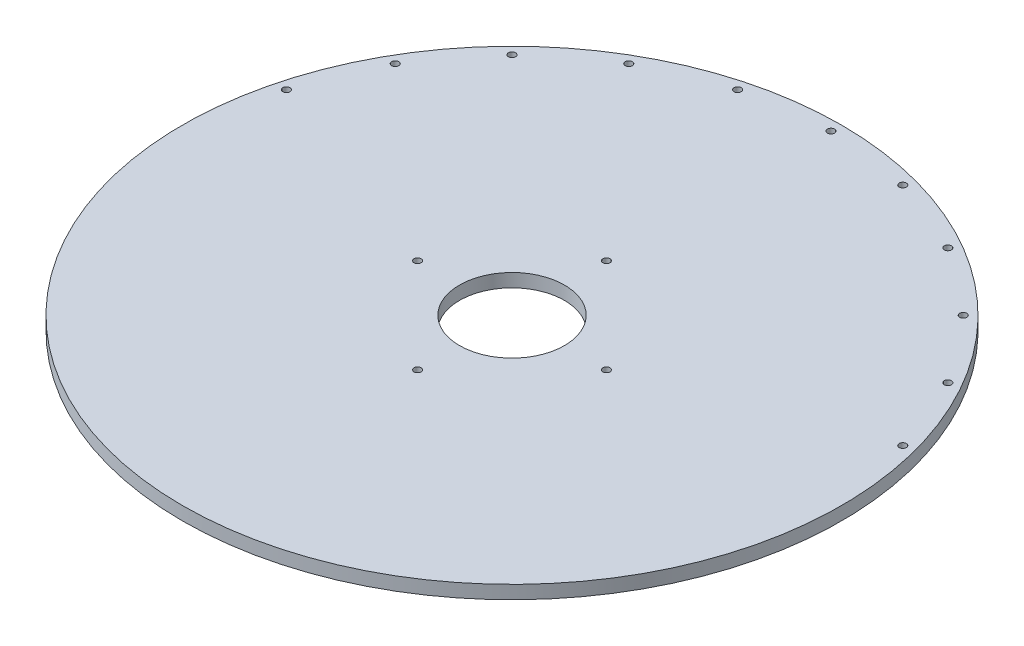
ISO-10303-21;
HEADER;
FILE_DESCRIPTION(('STEP AP214'),'2;1');
FILE_NAME('part.step','',(''),(''),'','','');
FILE_SCHEMA(('AUTOMOTIVE_DESIGN { 1 0 10303 214 1 1 1 1 }'));
ENDSEC;
DATA;
#1=APPLICATION_CONTEXT('core data for automotive mechanical design processes');
#2=APPLICATION_PROTOCOL_DEFINITION('international standard','automotive_design',2000,#1);
#3=PRODUCT_CONTEXT('',#1,'mechanical');
#4=PRODUCT('Part','Part','',(#3));
#5=PRODUCT_RELATED_PRODUCT_CATEGORY('part','',(#4));
#6=PRODUCT_DEFINITION_FORMATION('','',#4);
#7=PRODUCT_DEFINITION_CONTEXT('part definition',#1,'design');
#8=PRODUCT_DEFINITION('design','',#6,#7);
#9=PRODUCT_DEFINITION_SHAPE('','',#8);
#10=(LENGTH_UNIT() NAMED_UNIT(*) SI_UNIT(.MILLI.,.METRE.));
#11=(NAMED_UNIT(*) PLANE_ANGLE_UNIT() SI_UNIT($,.RADIAN.));
#12=(NAMED_UNIT(*) SI_UNIT($,.STERADIAN.) SOLID_ANGLE_UNIT());
#13=UNCERTAINTY_MEASURE_WITH_UNIT(LENGTH_MEASURE(1.E-05),#10,'distance_accuracy_value','');
#14=(GEOMETRIC_REPRESENTATION_CONTEXT(3) GLOBAL_UNCERTAINTY_ASSIGNED_CONTEXT((#13)) GLOBAL_UNIT_ASSIGNED_CONTEXT((#10,
#11,#12)) REPRESENTATION_CONTEXT('',''));
#15=CARTESIAN_POINT('',(0.,0.,0.));
#16=DIRECTION('',(0.,0.,1.));
#17=DIRECTION('',(1.,0.,0.));
#18=AXIS2_PLACEMENT_3D('',#15,#16,#17);
#19=CARTESIAN_POINT('',(0.,-6.35,0.));
#20=DIRECTION('',(0.,1.,0.));
#21=DIRECTION('',(0.,0.,1.));
#22=AXIS2_PLACEMENT_3D('',#19,#20,#21);
#23=CYLINDRICAL_SURFACE('',#22,157.);
#24=CARTESIAN_POINT('',(0.,-6.35,0.));
#25=DIRECTION('',(0.,1.,0.));
#26=DIRECTION('',(0.,0.,1.));
#27=AXIS2_PLACEMENT_3D('',#24,#25,#26);
#28=CIRCLE('',#27,157.);
#29=CARTESIAN_POINT('',(0.,-6.35,157.));
#30=VERTEX_POINT('',#29);
#31=EDGE_CURVE('E10',#30,#30,#28,.T.);
#32=ORIENTED_EDGE('',*,*,#31,.T.);
#33=EDGE_LOOP('',(#32));
#34=FACE_BOUND('',#33,.T.);
#35=CARTESIAN_POINT('',(0.,0.,0.));
#36=DIRECTION('',(0.,1.,0.));
#37=DIRECTION('',(0.,0.,1.));
#38=AXIS2_PLACEMENT_3D('',#35,#36,#37);
#39=CIRCLE('',#38,157.);
#40=CARTESIAN_POINT('',(0.,0.,157.));
#41=VERTEX_POINT('',#40);
#42=EDGE_CURVE('E40',#41,#41,#39,.T.);
#43=ORIENTED_EDGE('',*,*,#42,.F.);
#44=EDGE_LOOP('',(#43));
#45=FACE_BOUND('',#44,.T.);
#46=ADVANCED_FACE('F37',(#34,#45),#23,.T.);
#47=CARTESIAN_POINT('',(0.,-6.35,0.));
#48=DIRECTION('',(0.,1.,0.));
#49=DIRECTION('',(0.,0.,1.));
#50=AXIS2_PLACEMENT_3D('',#47,#48,#49);
#51=PLANE('',#50);
#52=CARTESIAN_POINT('',(-131.635861375235,-6.35,-75.9999999999992));
#53=DIRECTION('',(0.,1.,0.));
#54=DIRECTION('',(-0.258819045102521,0.,0.965925826289068));
#55=AXIS2_PLACEMENT_3D('',#52,#53,#54);
#56=CIRCLE('',#55,1.70000000000001);
#57=CARTESIAN_POINT('',(-132.075853751909,-6.35,-74.3579260953078));
#58=VERTEX_POINT('',#57);
#59=EDGE_CURVE('E82',#58,#58,#56,.T.);
#60=ORIENTED_EDGE('',*,*,#59,.T.);
#61=EDGE_LOOP('',(#60));
#62=FACE_BOUND('',#61,.T.);
#63=CARTESIAN_POINT('',(-107.480230740356,-6.35,-107.480230740355));
#64=DIRECTION('',(0.,1.,0.));
#65=DIRECTION('',(-0.500000000000001,0.,0.866025403784438));
#66=AXIS2_PLACEMENT_3D('',#63,#64,#65);
#67=CIRCLE('',#66,1.70000000000001);
#68=CARTESIAN_POINT('',(-108.330230740356,-6.35,-106.007987553921));
#69=VERTEX_POINT('',#68);
#70=EDGE_CURVE('E136',#69,#69,#67,.T.);
#71=ORIENTED_EDGE('',*,*,#70,.T.);
#72=EDGE_LOOP('',(#71));
#73=FACE_BOUND('',#72,.T.);
#74=CARTESIAN_POINT('',(-76.0000000000007,-6.35,-131.635861375234));
#75=DIRECTION('',(0.,1.,0.));
#76=DIRECTION('',(-0.707106781186549,0.,0.707106781186546));
#77=AXIS2_PLACEMENT_3D('',#74,#75,#76);
#78=CIRCLE('',#77,1.70000000000001);
#79=CARTESIAN_POINT('',(-77.2020815280178,-6.35,-130.433779847217));
#80=VERTEX_POINT('',#79);
#81=EDGE_CURVE('E130',#80,#80,#78,.T.);
#82=ORIENTED_EDGE('',*,*,#81,.T.);
#83=EDGE_LOOP('',(#82));
#84=FACE_BOUND('',#83,.T.);
#85=CARTESIAN_POINT('',(-39.3404948555838,-6.35,-146.820725595938));
#86=DIRECTION('',(0.,1.,0.));
#87=DIRECTION('',(-0.86602540378444,0.,0.499999999999998));
#88=AXIS2_PLACEMENT_3D('',#85,#86,#87);
#89=CIRCLE('',#88,1.70000000000001);
#90=CARTESIAN_POINT('',(-40.8127380420174,-6.35,-145.970725595938));
#91=VERTEX_POINT('',#90);
#92=EDGE_CURVE('E124',#91,#91,#89,.T.);
#93=ORIENTED_EDGE('',*,*,#92,.T.);
#94=EDGE_LOOP('',(#93));
#95=FACE_BOUND('',#94,.T.);
#96=CARTESIAN_POINT('',(-5.759281940243E-13,-6.35,-152.));
#97=DIRECTION('',(0.,1.,0.));
#98=DIRECTION('',(-0.965925826289069,0.,0.258819045102518));
#99=AXIS2_PLACEMENT_3D('',#96,#97,#98);
#100=CIRCLE('',#99,1.70000000000001);
#101=CARTESIAN_POINT('',(-1.64207390469201,-6.35,-151.560007623326));
#102=VERTEX_POINT('',#101);
#103=EDGE_CURVE('E118',#102,#102,#100,.T.);
#104=ORIENTED_EDGE('',*,*,#103,.T.);
#105=EDGE_LOOP('',(#104));
#106=FACE_BOUND('',#105,.T.);
#107=CARTESIAN_POINT('',(39.3404948555827,-6.35,-146.820725595939));
#108=DIRECTION('',(0.,1.,0.));
#109=DIRECTION('',(-1.,0.,0.));
#110=AXIS2_PLACEMENT_3D('',#107,#108,#109);
#111=CIRCLE('',#110,1.70000000000001);
#112=CARTESIAN_POINT('',(37.6404948555827,-6.35,-146.820725595939));
#113=VERTEX_POINT('',#112);
#114=EDGE_CURVE('E112',#113,#113,#111,.T.);
#115=ORIENTED_EDGE('',*,*,#114,.T.);
#116=EDGE_LOOP('',(#115));
#117=FACE_BOUND('',#116,.T.);
#118=CARTESIAN_POINT('',(75.9999999999997,-6.35,-131.635861375235));
#119=DIRECTION('',(0.,1.,0.));
#120=DIRECTION('',(-0.965925826289067,0.,-0.258819045102525));
#121=AXIS2_PLACEMENT_3D('',#118,#119,#120);
#122=CIRCLE('',#121,1.70000000000001);
#123=CARTESIAN_POINT('',(74.3579260953083,-6.35,-132.075853751909));
#124=VERTEX_POINT('',#123);
#125=EDGE_CURVE('E106',#124,#124,#122,.T.);
#126=ORIENTED_EDGE('',*,*,#125,.T.);
#127=EDGE_LOOP('',(#126));
#128=FACE_BOUND('',#127,.T.);
#129=CARTESIAN_POINT('',(107.480230740355,-6.35,-107.480230740355));
#130=DIRECTION('',(0.,1.,0.));
#131=DIRECTION('',(-0.866025403784436,0.,-0.500000000000004));
#132=AXIS2_PLACEMENT_3D('',#129,#130,#131);
#133=CIRCLE('',#132,1.70000000000001);
#134=CARTESIAN_POINT('',(106.007987553921,-6.35,-108.330230740356));
#135=VERTEX_POINT('',#134);
#136=EDGE_CURVE('E100',#135,#135,#133,.T.);
#137=ORIENTED_EDGE('',*,*,#136,.T.);
#138=EDGE_LOOP('',(#137));
#139=FACE_BOUND('',#138,.T.);
#140=CARTESIAN_POINT('',(131.635861375235,-6.35,-76.0000000000002));
#141=DIRECTION('',(0.,1.,0.));
#142=DIRECTION('',(-0.707106781186544,0.,-0.707106781186551));
#143=AXIS2_PLACEMENT_3D('',#140,#141,#142);
#144=CIRCLE('',#143,1.70000000000001);
#145=CARTESIAN_POINT('',(130.433779847217,-6.35,-77.2020815280174));
#146=VERTEX_POINT('',#145);
#147=EDGE_CURVE('E94',#146,#146,#144,.T.);
#148=ORIENTED_EDGE('',*,*,#147,.T.);
#149=EDGE_LOOP('',(#148));
#150=FACE_BOUND('',#149,.T.);
#151=CARTESIAN_POINT('',(146.820725595938,-6.35,-39.3404948555833));
#152=DIRECTION('',(0.,1.,0.));
#153=DIRECTION('',(-0.499999999999995,0.,-0.866025403784442));
#154=AXIS2_PLACEMENT_3D('',#151,#152,#153);
#155=CIRCLE('',#154,1.70000000000001);
#156=CARTESIAN_POINT('',(145.970725595938,-6.35,-40.8127380420169));
#157=VERTEX_POINT('',#156);
#158=EDGE_CURVE('E88',#157,#157,#155,.T.);
#159=ORIENTED_EDGE('',*,*,#158,.T.);
#160=EDGE_LOOP('',(#159));
#161=FACE_BOUND('',#160,.T.);
#162=CARTESIAN_POINT('',(-146.820725595939,-6.35,-39.3404948555822));
#163=DIRECTION('',(0.,1.,0.));
#164=DIRECTION('',(0.,0.,1.));
#165=AXIS2_PLACEMENT_3D('',#162,#163,#164);
#166=CIRCLE('',#165,1.70000000000001);
#167=CARTESIAN_POINT('',(-146.820725595939,-6.35,-37.6404948555822));
#168=VERTEX_POINT('',#167);
#169=EDGE_CURVE('E65',#168,#168,#166,.T.);
#170=ORIENTED_EDGE('',*,*,#169,.T.);
#171=EDGE_LOOP('',(#170));
#172=FACE_BOUND('',#171,.T.);
#173=CARTESIAN_POINT('',(-45.,-6.35,-1.57116660247941E-13));
#174=DIRECTION('',(0.,-1.,0.));
#175=DIRECTION('',(1.,0.,0.));
#176=AXIS2_PLACEMENT_3D('',#173,#174,#175);
#177=CIRCLE('',#176,1.7);
#178=CARTESIAN_POINT('',(-43.3,-6.35,-1.51181141971908E-13));
#179=VERTEX_POINT('',#178);
#180=EDGE_CURVE('E74',#179,#179,#177,.T.);
#181=ORIENTED_EDGE('',*,*,#180,.F.);
#182=EDGE_LOOP('',(#181));
#183=FACE_BOUND('',#182,.T.);
#184=CARTESIAN_POINT('',(0.,-6.35,-45.));
#185=DIRECTION('',(0.,-1.,0.));
#186=DIRECTION('',(0.,0.,1.));
#187=AXIS2_PLACEMENT_3D('',#184,#185,#186);
#188=CIRCLE('',#187,1.7);
#189=CARTESIAN_POINT('',(0.,-6.35,-43.3));
#190=VERTEX_POINT('',#189);
#191=EDGE_CURVE('E68',#190,#190,#188,.T.);
#192=ORIENTED_EDGE('',*,*,#191,.F.);
#193=EDGE_LOOP('',(#192));
#194=FACE_BOUND('',#193,.T.);
#195=CARTESIAN_POINT('',(45.,-6.35,4.71349980743823E-13));
#196=DIRECTION('',(0.,-1.,0.));
#197=DIRECTION('',(-1.,0.,0.));
#198=AXIS2_PLACEMENT_3D('',#195,#196,#197);
#199=CIRCLE('',#198,1.7);
#200=CARTESIAN_POINT('',(43.3,-6.35,4.53543425915723E-13));
#201=VERTEX_POINT('',#200);
#202=EDGE_CURVE('E61',#201,#201,#199,.T.);
#203=ORIENTED_EDGE('',*,*,#202,.F.);
#204=EDGE_LOOP('',(#203));
#205=FACE_BOUND('',#204,.T.);
#206=CARTESIAN_POINT('',(0.,-6.35,45.));
#207=DIRECTION('',(0.,-1.,0.));
#208=DIRECTION('',(0.,0.,-1.));
#209=AXIS2_PLACEMENT_3D('',#206,#207,#208);
#210=CIRCLE('',#209,1.7);
#211=CARTESIAN_POINT('',(0.,-6.35,43.3));
#212=VERTEX_POINT('',#211);
#213=EDGE_CURVE('E55',#212,#212,#210,.T.);
#214=ORIENTED_EDGE('',*,*,#213,.F.);
#215=EDGE_LOOP('',(#214));
#216=FACE_BOUND('',#215,.T.);
#217=CARTESIAN_POINT('',(0.,-6.35,0.));
#218=DIRECTION('',(0.,1.,0.));
#219=DIRECTION('',(0.,0.,1.));
#220=AXIS2_PLACEMENT_3D('',#217,#218,#219);
#221=CIRCLE('',#220,25.);
#222=CARTESIAN_POINT('',(0.,-6.35,25.));
#223=VERTEX_POINT('',#222);
#224=EDGE_CURVE('E47',#223,#223,#221,.T.);
#225=ORIENTED_EDGE('',*,*,#224,.T.);
#226=EDGE_LOOP('',(#225));
#227=FACE_BOUND('',#226,.T.);
#228=ORIENTED_EDGE('',*,*,#31,.F.);
#229=EDGE_LOOP('',(#228));
#230=FACE_BOUND('',#229,.T.);
#231=ADVANCED_FACE('F145',(#62,#73,#84,#95,#106,#117,#128,#139,#150,#161,#172,#183,#194,#205,
#216,#227,#230),#51,.F.);
#232=CARTESIAN_POINT('',(0.,0.,0.));
#233=DIRECTION('',(0.,1.,0.));
#234=DIRECTION('',(0.,0.,1.));
#235=AXIS2_PLACEMENT_3D('',#232,#233,#234);
#236=PLANE('',#235);
#237=CARTESIAN_POINT('',(-131.635861375235,0.,-75.9999999999992));
#238=DIRECTION('',(0.,1.,0.));
#239=DIRECTION('',(-0.258819045102521,0.,0.965925826289068));
#240=AXIS2_PLACEMENT_3D('',#237,#238,#239);
#241=CIRCLE('',#240,1.70000000000001);
#242=CARTESIAN_POINT('',(-132.075853751909,0.,-74.3579260953078));
#243=VERTEX_POINT('',#242);
#244=EDGE_CURVE('E139',#243,#243,#241,.T.);
#245=ORIENTED_EDGE('',*,*,#244,.F.);
#246=EDGE_LOOP('',(#245));
#247=FACE_BOUND('',#246,.T.);
#248=CARTESIAN_POINT('',(-107.480230740356,0.,-107.480230740355));
#249=DIRECTION('',(0.,1.,0.));
#250=DIRECTION('',(-0.500000000000001,0.,0.866025403784438));
#251=AXIS2_PLACEMENT_3D('',#248,#249,#250);
#252=CIRCLE('',#251,1.70000000000001);
#253=CARTESIAN_POINT('',(-108.330230740356,0.,-106.007987553921));
#254=VERTEX_POINT('',#253);
#255=EDGE_CURVE('E133',#254,#254,#252,.T.);
#256=ORIENTED_EDGE('',*,*,#255,.F.);
#257=EDGE_LOOP('',(#256));
#258=FACE_BOUND('',#257,.T.);
#259=CARTESIAN_POINT('',(-76.0000000000007,0.,-131.635861375234));
#260=DIRECTION('',(0.,1.,0.));
#261=DIRECTION('',(-0.707106781186549,0.,0.707106781186546));
#262=AXIS2_PLACEMENT_3D('',#259,#260,#261);
#263=CIRCLE('',#262,1.70000000000001);
#264=CARTESIAN_POINT('',(-77.2020815280178,0.,-130.433779847217));
#265=VERTEX_POINT('',#264);
#266=EDGE_CURVE('E127',#265,#265,#263,.T.);
#267=ORIENTED_EDGE('',*,*,#266,.F.);
#268=EDGE_LOOP('',(#267));
#269=FACE_BOUND('',#268,.T.);
#270=CARTESIAN_POINT('',(-39.3404948555838,0.,-146.820725595938));
#271=DIRECTION('',(0.,1.,0.));
#272=DIRECTION('',(-0.86602540378444,0.,0.499999999999998));
#273=AXIS2_PLACEMENT_3D('',#270,#271,#272);
#274=CIRCLE('',#273,1.70000000000001);
#275=CARTESIAN_POINT('',(-40.8127380420174,0.,-145.970725595938));
#276=VERTEX_POINT('',#275);
#277=EDGE_CURVE('E121',#276,#276,#274,.T.);
#278=ORIENTED_EDGE('',*,*,#277,.F.);
#279=EDGE_LOOP('',(#278));
#280=FACE_BOUND('',#279,.T.);
#281=CARTESIAN_POINT('',(-5.759281940243E-13,0.,-152.));
#282=DIRECTION('',(0.,1.,0.));
#283=DIRECTION('',(-0.965925826289069,0.,0.258819045102518));
#284=AXIS2_PLACEMENT_3D('',#281,#282,#283);
#285=CIRCLE('',#284,1.70000000000001);
#286=CARTESIAN_POINT('',(-1.64207390469201,0.,-151.560007623326));
#287=VERTEX_POINT('',#286);
#288=EDGE_CURVE('E115',#287,#287,#285,.T.);
#289=ORIENTED_EDGE('',*,*,#288,.F.);
#290=EDGE_LOOP('',(#289));
#291=FACE_BOUND('',#290,.T.);
#292=CARTESIAN_POINT('',(39.3404948555827,0.,-146.820725595939));
#293=DIRECTION('',(0.,1.,0.));
#294=DIRECTION('',(-1.,0.,0.));
#295=AXIS2_PLACEMENT_3D('',#292,#293,#294);
#296=CIRCLE('',#295,1.70000000000001);
#297=CARTESIAN_POINT('',(37.6404948555827,0.,-146.820725595939));
#298=VERTEX_POINT('',#297);
#299=EDGE_CURVE('E109',#298,#298,#296,.T.);
#300=ORIENTED_EDGE('',*,*,#299,.F.);
#301=EDGE_LOOP('',(#300));
#302=FACE_BOUND('',#301,.T.);
#303=CARTESIAN_POINT('',(75.9999999999997,0.,-131.635861375235));
#304=DIRECTION('',(0.,1.,0.));
#305=DIRECTION('',(-0.965925826289067,0.,-0.258819045102525));
#306=AXIS2_PLACEMENT_3D('',#303,#304,#305);
#307=CIRCLE('',#306,1.70000000000001);
#308=CARTESIAN_POINT('',(74.3579260953083,0.,-132.075853751909));
#309=VERTEX_POINT('',#308);
#310=EDGE_CURVE('E103',#309,#309,#307,.T.);
#311=ORIENTED_EDGE('',*,*,#310,.F.);
#312=EDGE_LOOP('',(#311));
#313=FACE_BOUND('',#312,.T.);
#314=CARTESIAN_POINT('',(107.480230740355,0.,-107.480230740355));
#315=DIRECTION('',(0.,1.,0.));
#316=DIRECTION('',(-0.866025403784436,0.,-0.500000000000004));
#317=AXIS2_PLACEMENT_3D('',#314,#315,#316);
#318=CIRCLE('',#317,1.70000000000001);
#319=CARTESIAN_POINT('',(106.007987553921,0.,-108.330230740356));
#320=VERTEX_POINT('',#319);
#321=EDGE_CURVE('E97',#320,#320,#318,.T.);
#322=ORIENTED_EDGE('',*,*,#321,.F.);
#323=EDGE_LOOP('',(#322));
#324=FACE_BOUND('',#323,.T.);
#325=CARTESIAN_POINT('',(131.635861375235,0.,-76.0000000000002));
#326=DIRECTION('',(0.,1.,0.));
#327=DIRECTION('',(-0.707106781186544,0.,-0.707106781186551));
#328=AXIS2_PLACEMENT_3D('',#325,#326,#327);
#329=CIRCLE('',#328,1.70000000000001);
#330=CARTESIAN_POINT('',(130.433779847217,0.,-77.2020815280174));
#331=VERTEX_POINT('',#330);
#332=EDGE_CURVE('E91',#331,#331,#329,.T.);
#333=ORIENTED_EDGE('',*,*,#332,.F.);
#334=EDGE_LOOP('',(#333));
#335=FACE_BOUND('',#334,.T.);
#336=CARTESIAN_POINT('',(146.820725595938,0.,-39.3404948555833));
#337=DIRECTION('',(0.,1.,0.));
#338=DIRECTION('',(-0.499999999999995,0.,-0.866025403784442));
#339=AXIS2_PLACEMENT_3D('',#336,#337,#338);
#340=CIRCLE('',#339,1.70000000000001);
#341=CARTESIAN_POINT('',(145.970725595938,0.,-40.8127380420169));
#342=VERTEX_POINT('',#341);
#343=EDGE_CURVE('E85',#342,#342,#340,.T.);
#344=ORIENTED_EDGE('',*,*,#343,.F.);
#345=EDGE_LOOP('',(#344));
#346=FACE_BOUND('',#345,.T.);
#347=CARTESIAN_POINT('',(-146.820725595939,0.,-39.3404948555822));
#348=DIRECTION('',(0.,1.,0.));
#349=DIRECTION('',(0.,0.,1.));
#350=AXIS2_PLACEMENT_3D('',#347,#348,#349);
#351=CIRCLE('',#350,1.70000000000001);
#352=CARTESIAN_POINT('',(-146.820725595939,0.,-37.6404948555822));
#353=VERTEX_POINT('',#352);
#354=EDGE_CURVE('E79',#353,#353,#351,.T.);
#355=ORIENTED_EDGE('',*,*,#354,.F.);
#356=EDGE_LOOP('',(#355));
#357=FACE_BOUND('',#356,.T.);
#358=CARTESIAN_POINT('',(-45.,0.,-1.57116660247941E-13));
#359=DIRECTION('',(0.,-1.,0.));
#360=DIRECTION('',(1.,0.,0.));
#361=AXIS2_PLACEMENT_3D('',#358,#359,#360);
#362=CIRCLE('',#361,1.7);
#363=CARTESIAN_POINT('',(-43.3,0.,-1.51181141971908E-13));
#364=VERTEX_POINT('',#363);
#365=EDGE_CURVE('E58',#364,#364,#362,.T.);
#366=ORIENTED_EDGE('',*,*,#365,.T.);
#367=EDGE_LOOP('',(#366));
#368=FACE_BOUND('',#367,.T.);
#369=CARTESIAN_POINT('',(0.,0.,-45.));
#370=DIRECTION('',(0.,-1.,0.));
#371=DIRECTION('',(0.,0.,1.));
#372=AXIS2_PLACEMENT_3D('',#369,#370,#371);
#373=CIRCLE('',#372,1.7);
#374=CARTESIAN_POINT('',(0.,0.,-43.3));
#375=VERTEX_POINT('',#374);
#376=EDGE_CURVE('E71',#375,#375,#373,.T.);
#377=ORIENTED_EDGE('',*,*,#376,.T.);
#378=EDGE_LOOP('',(#377));
#379=FACE_BOUND('',#378,.T.);
#380=CARTESIAN_POINT('',(45.,0.,4.71349980743823E-13));
#381=DIRECTION('',(0.,-1.,0.));
#382=DIRECTION('',(-1.,0.,0.));
#383=AXIS2_PLACEMENT_3D('',#380,#381,#382);
#384=CIRCLE('',#383,1.7);
#385=CARTESIAN_POINT('',(43.3,0.,4.53543425915723E-13));
#386=VERTEX_POINT('',#385);
#387=EDGE_CURVE('E64',#386,#386,#384,.T.);
#388=ORIENTED_EDGE('',*,*,#387,.T.);
#389=EDGE_LOOP('',(#388));
#390=FACE_BOUND('',#389,.T.);
#391=CARTESIAN_POINT('',(0.,0.,45.));
#392=DIRECTION('',(0.,-1.,0.));
#393=DIRECTION('',(0.,0.,-1.));
#394=AXIS2_PLACEMENT_3D('',#391,#392,#393);
#395=CIRCLE('',#394,1.7);
#396=CARTESIAN_POINT('',(0.,0.,43.3));
#397=VERTEX_POINT('',#396);
#398=EDGE_CURVE('E52',#397,#397,#395,.T.);
#399=ORIENTED_EDGE('',*,*,#398,.T.);
#400=EDGE_LOOP('',(#399));
#401=FACE_BOUND('',#400,.T.);
#402=CARTESIAN_POINT('',(0.,0.,0.));
#403=DIRECTION('',(0.,1.,0.));
#404=DIRECTION('',(0.,0.,1.));
#405=AXIS2_PLACEMENT_3D('',#402,#403,#404);
#406=CIRCLE('',#405,25.);
#407=CARTESIAN_POINT('',(0.,0.,25.));
#408=VERTEX_POINT('',#407);
#409=EDGE_CURVE('E49',#408,#408,#406,.T.);
#410=ORIENTED_EDGE('',*,*,#409,.F.);
#411=EDGE_LOOP('',(#410));
#412=FACE_BOUND('',#411,.T.);
#413=ORIENTED_EDGE('',*,*,#42,.T.);
#414=EDGE_LOOP('',(#413));
#415=FACE_BOUND('',#414,.T.);
#416=ADVANCED_FACE('F155',(#247,#258,#269,#280,#291,#302,#313,#324,#335,#346,#357,#368,#379,
#390,#401,#412,#415),#236,.T.);
#417=CARTESIAN_POINT('',(0.,-6.35,0.));
#418=DIRECTION('',(0.,1.,0.));
#419=DIRECTION('',(0.,0.,1.));
#420=AXIS2_PLACEMENT_3D('',#417,#418,#419);
#421=CYLINDRICAL_SURFACE('',#420,25.);
#422=ORIENTED_EDGE('',*,*,#224,.F.);
#423=EDGE_LOOP('',(#422));
#424=FACE_BOUND('',#423,.T.);
#425=ORIENTED_EDGE('',*,*,#409,.T.);
#426=EDGE_LOOP('',(#425));
#427=FACE_BOUND('',#426,.T.);
#428=ADVANCED_FACE('F158',(#424,#427),#421,.F.);
#429=CARTESIAN_POINT('',(0.,0.,45.));
#430=DIRECTION('',(0.,-1.,0.));
#431=DIRECTION('',(0.,0.,-1.));
#432=AXIS2_PLACEMENT_3D('',#429,#430,#431);
#433=CYLINDRICAL_SURFACE('',#432,1.7);
#434=ORIENTED_EDGE('',*,*,#398,.F.);
#435=EDGE_LOOP('',(#434));
#436=FACE_BOUND('',#435,.T.);
#437=ORIENTED_EDGE('',*,*,#213,.T.);
#438=EDGE_LOOP('',(#437));
#439=FACE_BOUND('',#438,.T.);
#440=ADVANCED_FACE('F202',(#436,#439),#433,.F.);
#441=CARTESIAN_POINT('',(45.,0.,4.71349980743823E-13));
#442=DIRECTION('',(0.,-1.,0.));
#443=DIRECTION('',(0.,0.,-1.));
#444=AXIS2_PLACEMENT_3D('',#441,#442,#443);
#445=CYLINDRICAL_SURFACE('',#444,1.7);
#446=ORIENTED_EDGE('',*,*,#387,.F.);
#447=EDGE_LOOP('',(#446));
#448=FACE_BOUND('',#447,.T.);
#449=ORIENTED_EDGE('',*,*,#202,.T.);
#450=EDGE_LOOP('',(#449));
#451=FACE_BOUND('',#450,.T.);
#452=ADVANCED_FACE('F206',(#448,#451),#445,.F.);
#453=CARTESIAN_POINT('',(0.,0.,-45.));
#454=DIRECTION('',(0.,-1.,0.));
#455=DIRECTION('',(0.,0.,-1.));
#456=AXIS2_PLACEMENT_3D('',#453,#454,#455);
#457=CYLINDRICAL_SURFACE('',#456,1.7);
#458=ORIENTED_EDGE('',*,*,#376,.F.);
#459=EDGE_LOOP('',(#458));
#460=FACE_BOUND('',#459,.T.);
#461=ORIENTED_EDGE('',*,*,#191,.T.);
#462=EDGE_LOOP('',(#461));
#463=FACE_BOUND('',#462,.T.);
#464=ADVANCED_FACE('F210',(#460,#463),#457,.F.);
#465=CARTESIAN_POINT('',(-45.,0.,-1.57116660247941E-13));
#466=DIRECTION('',(0.,-1.,0.));
#467=DIRECTION('',(0.,0.,-1.));
#468=AXIS2_PLACEMENT_3D('',#465,#466,#467);
#469=CYLINDRICAL_SURFACE('',#468,1.7);
#470=ORIENTED_EDGE('',*,*,#365,.F.);
#471=EDGE_LOOP('',(#470));
#472=FACE_BOUND('',#471,.T.);
#473=ORIENTED_EDGE('',*,*,#180,.T.);
#474=EDGE_LOOP('',(#473));
#475=FACE_BOUND('',#474,.T.);
#476=ADVANCED_FACE('F214',(#472,#475),#469,.F.);
#477=CARTESIAN_POINT('',(-146.820725595939,-6.35,-39.3404948555822));
#478=DIRECTION('',(0.,1.,0.));
#479=DIRECTION('',(0.,0.,1.));
#480=AXIS2_PLACEMENT_3D('',#477,#478,#479);
#481=CYLINDRICAL_SURFACE('',#480,1.70000000000001);
#482=ORIENTED_EDGE('',*,*,#169,.F.);
#483=EDGE_LOOP('',(#482));
#484=FACE_BOUND('',#483,.T.);
#485=ORIENTED_EDGE('',*,*,#354,.T.);
#486=EDGE_LOOP('',(#485));
#487=FACE_BOUND('',#486,.T.);
#488=ADVANCED_FACE('F218',(#484,#487),#481,.F.);
#489=CARTESIAN_POINT('',(146.820725595938,-6.35,-39.3404948555833));
#490=DIRECTION('',(0.,1.,0.));
#491=DIRECTION('',(0.,0.,1.));
#492=AXIS2_PLACEMENT_3D('',#489,#490,#491);
#493=CYLINDRICAL_SURFACE('',#492,1.70000000000001);
#494=ORIENTED_EDGE('',*,*,#158,.F.);
#495=EDGE_LOOP('',(#494));
#496=FACE_BOUND('',#495,.T.);
#497=ORIENTED_EDGE('',*,*,#343,.T.);
#498=EDGE_LOOP('',(#497));
#499=FACE_BOUND('',#498,.T.);
#500=ADVANCED_FACE('F221',(#496,#499),#493,.F.);
#501=CARTESIAN_POINT('',(131.635861375235,-6.35,-76.0000000000002));
#502=DIRECTION('',(0.,1.,0.));
#503=DIRECTION('',(0.,0.,1.));
#504=AXIS2_PLACEMENT_3D('',#501,#502,#503);
#505=CYLINDRICAL_SURFACE('',#504,1.70000000000001);
#506=ORIENTED_EDGE('',*,*,#147,.F.);
#507=EDGE_LOOP('',(#506));
#508=FACE_BOUND('',#507,.T.);
#509=ORIENTED_EDGE('',*,*,#332,.T.);
#510=EDGE_LOOP('',(#509));
#511=FACE_BOUND('',#510,.T.);
#512=ADVANCED_FACE('F225',(#508,#511),#505,.F.);
#513=CARTESIAN_POINT('',(107.480230740355,-6.35,-107.480230740355));
#514=DIRECTION('',(0.,1.,0.));
#515=DIRECTION('',(0.,0.,1.));
#516=AXIS2_PLACEMENT_3D('',#513,#514,#515);
#517=CYLINDRICAL_SURFACE('',#516,1.70000000000001);
#518=ORIENTED_EDGE('',*,*,#136,.F.);
#519=EDGE_LOOP('',(#518));
#520=FACE_BOUND('',#519,.T.);
#521=ORIENTED_EDGE('',*,*,#321,.T.);
#522=EDGE_LOOP('',(#521));
#523=FACE_BOUND('',#522,.T.);
#524=ADVANCED_FACE('F229',(#520,#523),#517,.F.);
#525=CARTESIAN_POINT('',(75.9999999999997,-6.35,-131.635861375235));
#526=DIRECTION('',(0.,1.,0.));
#527=DIRECTION('',(0.,0.,1.));
#528=AXIS2_PLACEMENT_3D('',#525,#526,#527);
#529=CYLINDRICAL_SURFACE('',#528,1.70000000000001);
#530=ORIENTED_EDGE('',*,*,#125,.F.);
#531=EDGE_LOOP('',(#530));
#532=FACE_BOUND('',#531,.T.);
#533=ORIENTED_EDGE('',*,*,#310,.T.);
#534=EDGE_LOOP('',(#533));
#535=FACE_BOUND('',#534,.T.);
#536=ADVANCED_FACE('F233',(#532,#535),#529,.F.);
#537=CARTESIAN_POINT('',(39.3404948555827,-6.35,-146.820725595939));
#538=DIRECTION('',(0.,1.,0.));
#539=DIRECTION('',(0.,0.,1.));
#540=AXIS2_PLACEMENT_3D('',#537,#538,#539);
#541=CYLINDRICAL_SURFACE('',#540,1.70000000000001);
#542=ORIENTED_EDGE('',*,*,#114,.F.);
#543=EDGE_LOOP('',(#542));
#544=FACE_BOUND('',#543,.T.);
#545=ORIENTED_EDGE('',*,*,#299,.T.);
#546=EDGE_LOOP('',(#545));
#547=FACE_BOUND('',#546,.T.);
#548=ADVANCED_FACE('F237',(#544,#547),#541,.F.);
#549=CARTESIAN_POINT('',(-5.759281940243E-13,-6.35,-152.));
#550=DIRECTION('',(0.,1.,0.));
#551=DIRECTION('',(0.,0.,1.));
#552=AXIS2_PLACEMENT_3D('',#549,#550,#551);
#553=CYLINDRICAL_SURFACE('',#552,1.70000000000001);
#554=ORIENTED_EDGE('',*,*,#103,.F.);
#555=EDGE_LOOP('',(#554));
#556=FACE_BOUND('',#555,.T.);
#557=ORIENTED_EDGE('',*,*,#288,.T.);
#558=EDGE_LOOP('',(#557));
#559=FACE_BOUND('',#558,.T.);
#560=ADVANCED_FACE('F241',(#556,#559),#553,.F.);
#561=CARTESIAN_POINT('',(-39.3404948555838,-6.35,-146.820725595938));
#562=DIRECTION('',(0.,1.,0.));
#563=DIRECTION('',(0.,0.,1.));
#564=AXIS2_PLACEMENT_3D('',#561,#562,#563);
#565=CYLINDRICAL_SURFACE('',#564,1.70000000000001);
#566=ORIENTED_EDGE('',*,*,#92,.F.);
#567=EDGE_LOOP('',(#566));
#568=FACE_BOUND('',#567,.T.);
#569=ORIENTED_EDGE('',*,*,#277,.T.);
#570=EDGE_LOOP('',(#569));
#571=FACE_BOUND('',#570,.T.);
#572=ADVANCED_FACE('F245',(#568,#571),#565,.F.);
#573=CARTESIAN_POINT('',(-76.0000000000007,-6.35,-131.635861375234));
#574=DIRECTION('',(0.,1.,0.));
#575=DIRECTION('',(0.,0.,1.));
#576=AXIS2_PLACEMENT_3D('',#573,#574,#575);
#577=CYLINDRICAL_SURFACE('',#576,1.70000000000001);
#578=ORIENTED_EDGE('',*,*,#81,.F.);
#579=EDGE_LOOP('',(#578));
#580=FACE_BOUND('',#579,.T.);
#581=ORIENTED_EDGE('',*,*,#266,.T.);
#582=EDGE_LOOP('',(#581));
#583=FACE_BOUND('',#582,.T.);
#584=ADVANCED_FACE('F249',(#580,#583),#577,.F.);
#585=CARTESIAN_POINT('',(-107.480230740356,-6.35,-107.480230740355));
#586=DIRECTION('',(0.,1.,0.));
#587=DIRECTION('',(0.,0.,1.));
#588=AXIS2_PLACEMENT_3D('',#585,#586,#587);
#589=CYLINDRICAL_SURFACE('',#588,1.70000000000001);
#590=ORIENTED_EDGE('',*,*,#70,.F.);
#591=EDGE_LOOP('',(#590));
#592=FACE_BOUND('',#591,.T.);
#593=ORIENTED_EDGE('',*,*,#255,.T.);
#594=EDGE_LOOP('',(#593));
#595=FACE_BOUND('',#594,.T.);
#596=ADVANCED_FACE('F151',(#592,#595),#589,.F.);
#597=CARTESIAN_POINT('',(-131.635861375235,-6.35,-75.9999999999992));
#598=DIRECTION('',(0.,1.,0.));
#599=DIRECTION('',(0.,0.,1.));
#600=AXIS2_PLACEMENT_3D('',#597,#598,#599);
#601=CYLINDRICAL_SURFACE('',#600,1.70000000000001);
#602=ORIENTED_EDGE('',*,*,#59,.F.);
#603=EDGE_LOOP('',(#602));
#604=FACE_BOUND('',#603,.T.);
#605=ORIENTED_EDGE('',*,*,#244,.T.);
#606=EDGE_LOOP('',(#605));
#607=FACE_BOUND('',#606,.T.);
#608=ADVANCED_FACE('F148',(#604,#607),#601,.F.);
#609=CLOSED_SHELL('',(#46,#231,#416,#428,#440,#452,#464,#476,#488,#500,#512,#524,#536,#548,#560,
#572,#584,#596,#608));
#610=MANIFOLD_SOLID_BREP('B2',#609);
#611=ADVANCED_BREP_SHAPE_REPRESENTATION('',(#18,#610),#14);
#612=SHAPE_DEFINITION_REPRESENTATION(#9,#611);
ENDSEC;
END-ISO-10303-21;
